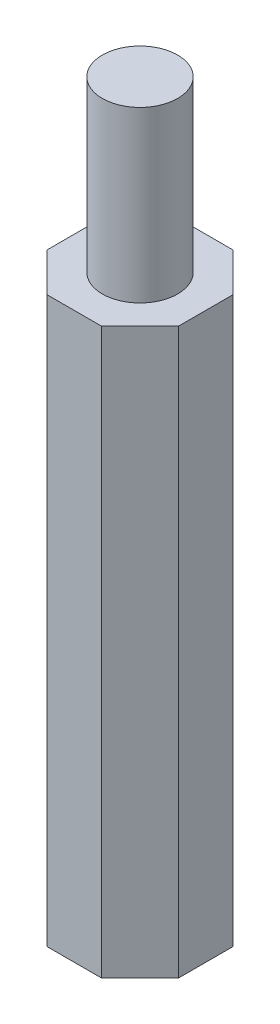
ISO-10303-21;
HEADER;
FILE_DESCRIPTION(('STEP AP214'),'2;1');
FILE_NAME('part.step','',(''),(''),'','','');
FILE_SCHEMA(('AUTOMOTIVE_DESIGN { 1 0 10303 214 1 1 1 1 }'));
ENDSEC;
DATA;
#1=APPLICATION_CONTEXT('core data for automotive mechanical design processes');
#2=APPLICATION_PROTOCOL_DEFINITION('international standard','automotive_design',2000,#1);
#3=PRODUCT_CONTEXT('',#1,'mechanical');
#4=PRODUCT('Part','Part','',(#3));
#5=PRODUCT_RELATED_PRODUCT_CATEGORY('part','',(#4));
#6=PRODUCT_DEFINITION_FORMATION('','',#4);
#7=PRODUCT_DEFINITION_CONTEXT('part definition',#1,'design');
#8=PRODUCT_DEFINITION('design','',#6,#7);
#9=PRODUCT_DEFINITION_SHAPE('','',#8);
#10=(LENGTH_UNIT() NAMED_UNIT(*) SI_UNIT(.MILLI.,.METRE.));
#11=(NAMED_UNIT(*) PLANE_ANGLE_UNIT() SI_UNIT($,.RADIAN.));
#12=(NAMED_UNIT(*) SI_UNIT($,.STERADIAN.) SOLID_ANGLE_UNIT());
#13=UNCERTAINTY_MEASURE_WITH_UNIT(LENGTH_MEASURE(1.E-05),#10,'distance_accuracy_value','');
#14=(GEOMETRIC_REPRESENTATION_CONTEXT(3) GLOBAL_UNCERTAINTY_ASSIGNED_CONTEXT((#13)) GLOBAL_UNIT_ASSIGNED_CONTEXT((#10,
#11,#12)) REPRESENTATION_CONTEXT('',''));
#15=CARTESIAN_POINT('',(0.,0.,0.));
#16=DIRECTION('',(0.,0.,1.));
#17=DIRECTION('',(1.,0.,0.));
#18=AXIS2_PLACEMENT_3D('',#15,#16,#17);
#19=CARTESIAN_POINT('',(-4.94974746830584,15.,0.));
#20=DIRECTION('',(0.,1.,0.));
#21=DIRECTION('',(0.,0.,1.));
#22=AXIS2_PLACEMENT_3D('',#19,#20,#21);
#23=PLANE('',#22);
#24=DIRECTION('',(-0.707106781186548,0.,0.707106781186546));
#25=VECTOR('',#24,1.);
#26=CARTESIAN_POINT('',(-3.5,15.,-1.44974746830583));
#27=LINE('',#26,#25);
#28=CARTESIAN_POINT('',(-1.44974746830583,15.,-3.5));
#29=VERTEX_POINT('',#28);
#30=CARTESIAN_POINT('',(-3.5,15.,-1.44974746830583));
#31=VERTEX_POINT('',#30);
#32=EDGE_CURVE('E144',#29,#31,#27,.T.);
#33=ORIENTED_EDGE('',*,*,#32,.T.);
#34=DIRECTION('',(0.,0.,1.));
#35=VECTOR('',#34,1.);
#36=CARTESIAN_POINT('',(-3.5,15.,1.44974746830583));
#37=LINE('',#36,#35);
#38=CARTESIAN_POINT('',(-3.5,15.,1.44974746830583));
#39=VERTEX_POINT('',#38);
#40=EDGE_CURVE('E92',#31,#39,#37,.T.);
#41=ORIENTED_EDGE('',*,*,#40,.T.);
#42=DIRECTION('',(0.707106781186548,0.,0.707106781186548));
#43=VECTOR('',#42,1.);
#44=CARTESIAN_POINT('',(-1.44974746830583,15.,3.5));
#45=LINE('',#44,#43);
#46=CARTESIAN_POINT('',(-1.44974746830583,15.,3.5));
#47=VERTEX_POINT('',#46);
#48=EDGE_CURVE('E159',#39,#47,#45,.T.);
#49=ORIENTED_EDGE('',*,*,#48,.T.);
#50=DIRECTION('',(1.,0.,0.));
#51=VECTOR('',#50,1.);
#52=CARTESIAN_POINT('',(1.44974746830583,15.,3.5));
#53=LINE('',#52,#51);
#54=CARTESIAN_POINT('',(1.44974746830583,15.,3.5));
#55=VERTEX_POINT('',#54);
#56=EDGE_CURVE('E171',#47,#55,#53,.T.);
#57=ORIENTED_EDGE('',*,*,#56,.T.);
#58=DIRECTION('',(0.707106781186548,0.,-0.707106781186547));
#59=VECTOR('',#58,1.);
#60=CARTESIAN_POINT('',(3.5,15.,1.44974746830583));
#61=LINE('',#60,#59);
#62=CARTESIAN_POINT('',(3.5,15.,1.44974746830583));
#63=VERTEX_POINT('',#62);
#64=EDGE_CURVE('E111',#55,#63,#61,.T.);
#65=ORIENTED_EDGE('',*,*,#64,.T.);
#66=DIRECTION('',(0.,0.,-1.));
#67=VECTOR('',#66,1.);
#68=CARTESIAN_POINT('',(3.5,15.,-1.44974746830583));
#69=LINE('',#68,#67);
#70=CARTESIAN_POINT('',(3.5,15.,-1.44974746830583));
#71=VERTEX_POINT('',#70);
#72=EDGE_CURVE('E105',#63,#71,#69,.T.);
#73=ORIENTED_EDGE('',*,*,#72,.T.);
#74=DIRECTION('',(-0.707106781186548,0.,-0.707106781186547));
#75=VECTOR('',#74,1.);
#76=CARTESIAN_POINT('',(1.44974746830583,15.,-3.5));
#77=LINE('',#76,#75);
#78=CARTESIAN_POINT('',(1.44974746830583,15.,-3.5));
#79=VERTEX_POINT('',#78);
#80=EDGE_CURVE('E109',#71,#79,#77,.T.);
#81=ORIENTED_EDGE('',*,*,#80,.T.);
#82=DIRECTION('',(-1.,0.,0.));
#83=VECTOR('',#82,1.);
#84=CARTESIAN_POINT('',(-1.44974746830583,15.,-3.5));
#85=LINE('',#84,#83);
#86=EDGE_CURVE('E49',#79,#29,#85,.T.);
#87=ORIENTED_EDGE('',*,*,#86,.T.);
#88=EDGE_LOOP('',(#33,#41,#49,#57,#65,#73,#81,#87));
#89=FACE_BOUND('',#88,.T.);
#90=CARTESIAN_POINT('',(0.,15.,0.));
#91=DIRECTION('',(0.,1.,0.));
#92=DIRECTION('',(0.,0.,1.));
#93=AXIS2_PLACEMENT_3D('',#90,#91,#92);
#94=CIRCLE('',#93,2.);
#95=CARTESIAN_POINT('',(0.,15.,2.));
#96=VERTEX_POINT('',#95);
#97=EDGE_CURVE('E177',#96,#96,#94,.T.);
#98=ORIENTED_EDGE('',*,*,#97,.F.);
#99=EDGE_LOOP('',(#98));
#100=FACE_BOUND('',#99,.T.);
#101=ADVANCED_FACE('F32',(#89,#100),#23,.T.);
#102=CARTESIAN_POINT('',(-3.5,15.,-1.44974746830583));
#103=DIRECTION('',(0.707106781186546,0.,0.707106781186549));
#104=DIRECTION('',(0.707106781186549,0.,-0.707106781186546));
#105=AXIS2_PLACEMENT_3D('',#102,#103,#104);
#106=PLANE('',#105);
#107=DIRECTION('',(-0.707106781186548,0.,0.707106781186546));
#108=VECTOR('',#107,1.);
#109=CARTESIAN_POINT('',(-3.5,-15.,-1.44974746830583));
#110=LINE('',#109,#108);
#111=CARTESIAN_POINT('',(-1.44974746830583,-15.,-3.5));
#112=VERTEX_POINT('',#111);
#113=CARTESIAN_POINT('',(-3.5,-15.,-1.44974746830583));
#114=VERTEX_POINT('',#113);
#115=EDGE_CURVE('E129',#112,#114,#110,.T.);
#116=ORIENTED_EDGE('',*,*,#115,.T.);
#117=DIRECTION('',(0.,-1.,0.));
#118=VECTOR('',#117,1.);
#119=CARTESIAN_POINT('',(-3.5,15.,-1.44974746830583));
#120=LINE('',#119,#118);
#121=EDGE_CURVE('E11',#31,#114,#120,.T.);
#122=ORIENTED_EDGE('',*,*,#121,.F.);
#123=ORIENTED_EDGE('',*,*,#32,.F.);
#124=DIRECTION('',(0.,-1.,0.));
#125=VECTOR('',#124,1.);
#126=CARTESIAN_POINT('',(-1.44974746830583,15.,-3.5));
#127=LINE('',#126,#125);
#128=EDGE_CURVE('E125',#29,#112,#127,.T.);
#129=ORIENTED_EDGE('',*,*,#128,.T.);
#130=EDGE_LOOP('',(#116,#122,#123,#129));
#131=FACE_BOUND('',#130,.T.);
#132=ADVANCED_FACE('F34',(#131),#106,.F.);
#133=CARTESIAN_POINT('',(-3.5,15.,1.44974746830583));
#134=DIRECTION('',(1.,0.,0.));
#135=DIRECTION('',(0.,0.,-1.));
#136=AXIS2_PLACEMENT_3D('',#133,#134,#135);
#137=PLANE('',#136);
#138=DIRECTION('',(0.,0.,1.));
#139=VECTOR('',#138,1.);
#140=CARTESIAN_POINT('',(-3.5,-15.,1.44974746830583));
#141=LINE('',#140,#139);
#142=CARTESIAN_POINT('',(-3.5,-15.,1.44974746830583));
#143=VERTEX_POINT('',#142);
#144=EDGE_CURVE('E132',#114,#143,#141,.T.);
#145=ORIENTED_EDGE('',*,*,#144,.T.);
#146=DIRECTION('',(0.,-1.,0.));
#147=VECTOR('',#146,1.);
#148=CARTESIAN_POINT('',(-3.5,15.,1.44974746830583));
#149=LINE('',#148,#147);
#150=EDGE_CURVE('E41',#39,#143,#149,.T.);
#151=ORIENTED_EDGE('',*,*,#150,.F.);
#152=ORIENTED_EDGE('',*,*,#40,.F.);
#153=ORIENTED_EDGE('',*,*,#121,.T.);
#154=EDGE_LOOP('',(#145,#151,#152,#153));
#155=FACE_BOUND('',#154,.T.);
#156=ADVANCED_FACE('F214',(#155),#137,.F.);
#157=CARTESIAN_POINT('',(-1.44974746830583,15.,3.5));
#158=DIRECTION('',(0.707106781186547,0.,-0.707106781186547));
#159=DIRECTION('',(-0.707106781186548,0.,-0.707106781186548));
#160=AXIS2_PLACEMENT_3D('',#157,#158,#159);
#161=PLANE('',#160);
#162=DIRECTION('',(0.707106781186548,0.,0.707106781186548));
#163=VECTOR('',#162,1.);
#164=CARTESIAN_POINT('',(-1.44974746830583,-15.,3.5));
#165=LINE('',#164,#163);
#166=CARTESIAN_POINT('',(-1.44974746830583,-15.,3.5));
#167=VERTEX_POINT('',#166);
#168=EDGE_CURVE('E135',#143,#167,#165,.T.);
#169=ORIENTED_EDGE('',*,*,#168,.T.);
#170=DIRECTION('',(0.,-1.,0.));
#171=VECTOR('',#170,1.);
#172=CARTESIAN_POINT('',(-1.44974746830583,15.,3.5));
#173=LINE('',#172,#171);
#174=EDGE_CURVE('E151',#47,#167,#173,.T.);
#175=ORIENTED_EDGE('',*,*,#174,.F.);
#176=ORIENTED_EDGE('',*,*,#48,.F.);
#177=ORIENTED_EDGE('',*,*,#150,.T.);
#178=EDGE_LOOP('',(#169,#175,#176,#177));
#179=FACE_BOUND('',#178,.T.);
#180=ADVANCED_FACE('F157',(#179),#161,.F.);
#181=CARTESIAN_POINT('',(1.44974746830583,15.,3.5));
#182=DIRECTION('',(0.,0.,-1.));
#183=DIRECTION('',(-1.,0.,0.));
#184=AXIS2_PLACEMENT_3D('',#181,#182,#183);
#185=PLANE('',#184);
#186=DIRECTION('',(1.,0.,0.));
#187=VECTOR('',#186,1.);
#188=CARTESIAN_POINT('',(1.44974746830583,-15.,3.5));
#189=LINE('',#188,#187);
#190=CARTESIAN_POINT('',(1.44974746830583,-15.,3.5));
#191=VERTEX_POINT('',#190);
#192=EDGE_CURVE('E137',#167,#191,#189,.T.);
#193=ORIENTED_EDGE('',*,*,#192,.T.);
#194=DIRECTION('',(0.,-1.,0.));
#195=VECTOR('',#194,1.);
#196=CARTESIAN_POINT('',(1.44974746830583,15.,3.5));
#197=LINE('',#196,#195);
#198=EDGE_CURVE('E148',#55,#191,#197,.T.);
#199=ORIENTED_EDGE('',*,*,#198,.F.);
#200=ORIENTED_EDGE('',*,*,#56,.F.);
#201=ORIENTED_EDGE('',*,*,#174,.T.);
#202=EDGE_LOOP('',(#193,#199,#200,#201));
#203=FACE_BOUND('',#202,.T.);
#204=ADVANCED_FACE('F167',(#203),#185,.F.);
#205=CARTESIAN_POINT('',(3.5,15.,1.44974746830583));
#206=DIRECTION('',(-0.707106781186547,0.,-0.707106781186548));
#207=DIRECTION('',(-0.707106781186548,0.,0.707106781186547));
#208=AXIS2_PLACEMENT_3D('',#205,#206,#207);
#209=PLANE('',#208);
#210=DIRECTION('',(0.707106781186548,0.,-0.707106781186547));
#211=VECTOR('',#210,1.);
#212=CARTESIAN_POINT('',(3.5,-15.,1.44974746830583));
#213=LINE('',#212,#211);
#214=CARTESIAN_POINT('',(3.5,-15.,1.44974746830583));
#215=VERTEX_POINT('',#214);
#216=EDGE_CURVE('E139',#191,#215,#213,.T.);
#217=ORIENTED_EDGE('',*,*,#216,.T.);
#218=DIRECTION('',(0.,-1.,0.));
#219=VECTOR('',#218,1.);
#220=CARTESIAN_POINT('',(3.5,15.,1.44974746830583));
#221=LINE('',#220,#219);
#222=EDGE_CURVE('E120',#63,#215,#221,.T.);
#223=ORIENTED_EDGE('',*,*,#222,.F.);
#224=ORIENTED_EDGE('',*,*,#64,.F.);
#225=ORIENTED_EDGE('',*,*,#198,.T.);
#226=EDGE_LOOP('',(#217,#223,#224,#225));
#227=FACE_BOUND('',#226,.T.);
#228=ADVANCED_FACE('F170',(#227),#209,.F.);
#229=CARTESIAN_POINT('',(3.5,15.,-1.44974746830583));
#230=DIRECTION('',(-1.,0.,0.));
#231=DIRECTION('',(0.,0.,1.));
#232=AXIS2_PLACEMENT_3D('',#229,#230,#231);
#233=PLANE('',#232);
#234=DIRECTION('',(0.,0.,-1.));
#235=VECTOR('',#234,1.);
#236=CARTESIAN_POINT('',(3.5,-15.,-1.44974746830583));
#237=LINE('',#236,#235);
#238=CARTESIAN_POINT('',(3.5,-15.,-1.44974746830583));
#239=VERTEX_POINT('',#238);
#240=EDGE_CURVE('E119',#215,#239,#237,.T.);
#241=ORIENTED_EDGE('',*,*,#240,.T.);
#242=DIRECTION('',(0.,-1.,0.));
#243=VECTOR('',#242,1.);
#244=CARTESIAN_POINT('',(3.5,15.,-1.44974746830583));
#245=LINE('',#244,#243);
#246=EDGE_CURVE('E116',#71,#239,#245,.T.);
#247=ORIENTED_EDGE('',*,*,#246,.F.);
#248=ORIENTED_EDGE('',*,*,#72,.F.);
#249=ORIENTED_EDGE('',*,*,#222,.T.);
#250=EDGE_LOOP('',(#241,#247,#248,#249));
#251=FACE_BOUND('',#250,.T.);
#252=ADVANCED_FACE('F117',(#251),#233,.F.);
#253=CARTESIAN_POINT('',(1.44974746830583,15.,-3.5));
#254=DIRECTION('',(-0.707106781186547,0.,0.707106781186548));
#255=DIRECTION('',(0.707106781186548,0.,0.707106781186547));
#256=AXIS2_PLACEMENT_3D('',#253,#254,#255);
#257=PLANE('',#256);
#258=DIRECTION('',(-0.707106781186548,0.,-0.707106781186547));
#259=VECTOR('',#258,1.);
#260=CARTESIAN_POINT('',(1.44974746830583,-15.,-3.5));
#261=LINE('',#260,#259);
#262=CARTESIAN_POINT('',(1.44974746830583,-15.,-3.5));
#263=VERTEX_POINT('',#262);
#264=EDGE_CURVE('E78',#239,#263,#261,.T.);
#265=ORIENTED_EDGE('',*,*,#264,.T.);
#266=DIRECTION('',(0.,-1.,0.));
#267=VECTOR('',#266,1.);
#268=CARTESIAN_POINT('',(1.44974746830583,15.,-3.5));
#269=LINE('',#268,#267);
#270=EDGE_CURVE('E121',#79,#263,#269,.T.);
#271=ORIENTED_EDGE('',*,*,#270,.F.);
#272=ORIENTED_EDGE('',*,*,#80,.F.);
#273=ORIENTED_EDGE('',*,*,#246,.T.);
#274=EDGE_LOOP('',(#265,#271,#272,#273));
#275=FACE_BOUND('',#274,.T.);
#276=ADVANCED_FACE('F123',(#275),#257,.F.);
#277=CARTESIAN_POINT('',(-1.44974746830583,15.,-3.5));
#278=DIRECTION('',(0.,0.,1.));
#279=DIRECTION('',(1.,0.,0.));
#280=AXIS2_PLACEMENT_3D('',#277,#278,#279);
#281=PLANE('',#280);
#282=DIRECTION('',(-1.,0.,0.));
#283=VECTOR('',#282,1.);
#284=CARTESIAN_POINT('',(-1.44974746830583,-15.,-3.5));
#285=LINE('',#284,#283);
#286=EDGE_CURVE('E84',#263,#112,#285,.T.);
#287=ORIENTED_EDGE('',*,*,#286,.T.);
#288=ORIENTED_EDGE('',*,*,#128,.F.);
#289=ORIENTED_EDGE('',*,*,#86,.F.);
#290=ORIENTED_EDGE('',*,*,#270,.T.);
#291=EDGE_LOOP('',(#287,#288,#289,#290));
#292=FACE_BOUND('',#291,.T.);
#293=ADVANCED_FACE('F200',(#292),#281,.F.);
#294=CARTESIAN_POINT('',(-4.94974746830584,-15.,0.));
#295=DIRECTION('',(0.,1.,0.));
#296=DIRECTION('',(0.,0.,1.));
#297=AXIS2_PLACEMENT_3D('',#294,#295,#296);
#298=PLANE('',#297);
#299=CARTESIAN_POINT('',(0.,-15.,0.));
#300=DIRECTION('',(0.,-1.,0.));
#301=DIRECTION('',(0.,0.,-1.));
#302=AXIS2_PLACEMENT_3D('',#299,#300,#301);
#303=CIRCLE('',#302,2.);
#304=CARTESIAN_POINT('',(0.,-15.,-2.));
#305=VERTEX_POINT('',#304);
#306=EDGE_CURVE('E183',#305,#305,#303,.T.);
#307=ORIENTED_EDGE('',*,*,#306,.F.);
#308=EDGE_LOOP('',(#307));
#309=FACE_BOUND('',#308,.T.);
#310=ORIENTED_EDGE('',*,*,#115,.F.);
#311=ORIENTED_EDGE('',*,*,#286,.F.);
#312=ORIENTED_EDGE('',*,*,#264,.F.);
#313=ORIENTED_EDGE('',*,*,#240,.F.);
#314=ORIENTED_EDGE('',*,*,#216,.F.);
#315=ORIENTED_EDGE('',*,*,#192,.F.);
#316=ORIENTED_EDGE('',*,*,#168,.F.);
#317=ORIENTED_EDGE('',*,*,#144,.F.);
#318=EDGE_LOOP('',(#310,#311,#312,#313,#314,#315,#316,#317));
#319=FACE_BOUND('',#318,.T.);
#320=ADVANCED_FACE('F163',(#309,#319),#298,.F.);
#321=CARTESIAN_POINT('',(0.,24.,0.));
#322=DIRECTION('',(0.,-1.,0.));
#323=DIRECTION('',(0.,0.,-1.));
#324=AXIS2_PLACEMENT_3D('',#321,#322,#323);
#325=CYLINDRICAL_SURFACE('',#324,2.);
#326=CARTESIAN_POINT('',(0.,24.,0.));
#327=DIRECTION('',(0.,1.,0.));
#328=DIRECTION('',(0.,0.,1.));
#329=AXIS2_PLACEMENT_3D('',#326,#327,#328);
#330=CIRCLE('',#329,2.);
#331=CARTESIAN_POINT('',(0.,24.,2.));
#332=VERTEX_POINT('',#331);
#333=EDGE_CURVE('E133',#332,#332,#330,.T.);
#334=ORIENTED_EDGE('',*,*,#333,.F.);
#335=EDGE_LOOP('',(#334));
#336=FACE_BOUND('',#335,.T.);
#337=ORIENTED_EDGE('',*,*,#97,.T.);
#338=EDGE_LOOP('',(#337));
#339=FACE_BOUND('',#338,.T.);
#340=ADVANCED_FACE('F199',(#336,#339),#325,.T.);
#341=CARTESIAN_POINT('',(0.,24.,0.));
#342=DIRECTION('',(0.,1.,0.));
#343=DIRECTION('',(0.,0.,1.));
#344=AXIS2_PLACEMENT_3D('',#341,#342,#343);
#345=PLANE('',#344);
#346=ORIENTED_EDGE('',*,*,#333,.T.);
#347=EDGE_LOOP('',(#346));
#348=FACE_BOUND('',#347,.T.);
#349=ADVANCED_FACE('F194',(#348),#345,.T.);
#350=CARTESIAN_POINT('',(0.,-6.,0.));
#351=DIRECTION('',(0.,-1.,0.));
#352=DIRECTION('',(0.,0.,-1.));
#353=AXIS2_PLACEMENT_3D('',#350,#351,#352);
#354=CYLINDRICAL_SURFACE('',#353,2.);
#355=CARTESIAN_POINT('',(0.,-6.,0.));
#356=DIRECTION('',(0.,-1.,0.));
#357=DIRECTION('',(0.,0.,-1.));
#358=AXIS2_PLACEMENT_3D('',#355,#356,#357);
#359=CIRCLE('',#358,2.);
#360=CARTESIAN_POINT('',(0.,-6.,-2.));
#361=VERTEX_POINT('',#360);
#362=EDGE_CURVE('E180',#361,#361,#359,.T.);
#363=ORIENTED_EDGE('',*,*,#362,.F.);
#364=EDGE_LOOP('',(#363));
#365=FACE_BOUND('',#364,.T.);
#366=ORIENTED_EDGE('',*,*,#306,.T.);
#367=EDGE_LOOP('',(#366));
#368=FACE_BOUND('',#367,.T.);
#369=ADVANCED_FACE('F191',(#365,#368),#354,.F.);
#370=CARTESIAN_POINT('',(0.,-6.,0.));
#371=DIRECTION('',(0.,-1.,0.));
#372=DIRECTION('',(0.,0.,-1.));
#373=AXIS2_PLACEMENT_3D('',#370,#371,#372);
#374=PLANE('',#373);
#375=ORIENTED_EDGE('',*,*,#362,.T.);
#376=EDGE_LOOP('',(#375));
#377=FACE_BOUND('',#376,.T.);
#378=ADVANCED_FACE('F189',(#377),#374,.T.);
#379=CLOSED_SHELL('',(#101,#132,#156,#180,#204,#228,#252,#276,#293,#320,#340,#349,#369,#378));
#380=MANIFOLD_SOLID_BREP('B2',#379);
#381=ADVANCED_BREP_SHAPE_REPRESENTATION('',(#18,#380),#14);
#382=SHAPE_DEFINITION_REPRESENTATION(#9,#381);
ENDSEC;
END-ISO-10303-21;
